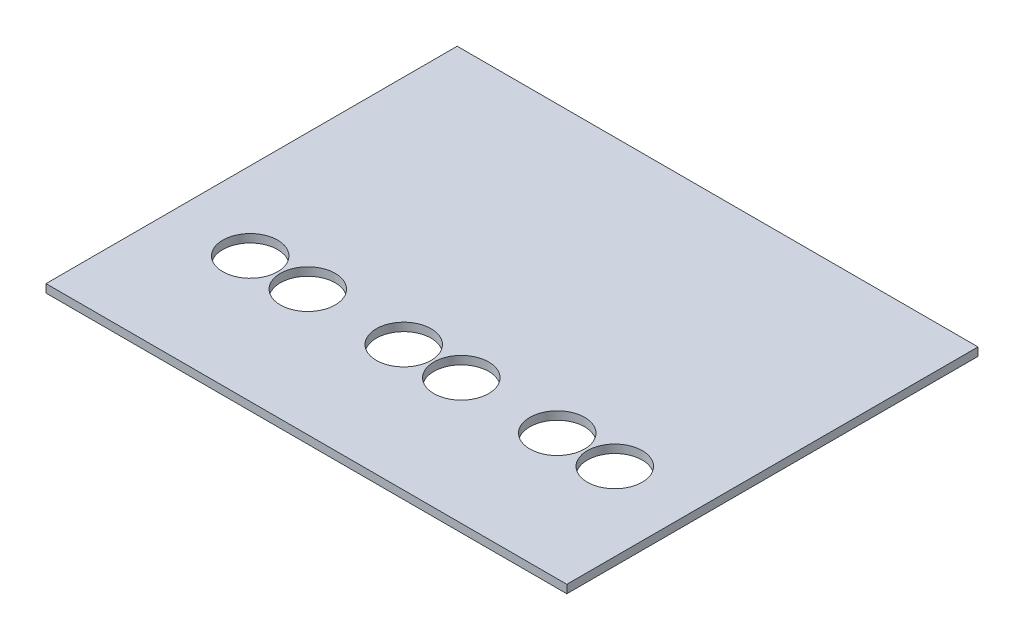
ISO-10303-21;
HEADER;
FILE_DESCRIPTION(('STEP AP214'),'2;1');
FILE_NAME('part.step','',(''),(''),'','','');
FILE_SCHEMA(('AUTOMOTIVE_DESIGN { 1 0 10303 214 1 1 1 1 }'));
ENDSEC;
DATA;
#1=APPLICATION_CONTEXT('core data for automotive mechanical design processes');
#2=APPLICATION_PROTOCOL_DEFINITION('international standard','automotive_design',2000,#1);
#3=PRODUCT_CONTEXT('',#1,'mechanical');
#4=PRODUCT('Part','Part','',(#3));
#5=PRODUCT_RELATED_PRODUCT_CATEGORY('part','',(#4));
#6=PRODUCT_DEFINITION_FORMATION('','',#4);
#7=PRODUCT_DEFINITION_CONTEXT('part definition',#1,'design');
#8=PRODUCT_DEFINITION('design','',#6,#7);
#9=PRODUCT_DEFINITION_SHAPE('','',#8);
#10=(LENGTH_UNIT() NAMED_UNIT(*) SI_UNIT(.MILLI.,.METRE.));
#11=(NAMED_UNIT(*) PLANE_ANGLE_UNIT() SI_UNIT($,.RADIAN.));
#12=(NAMED_UNIT(*) SI_UNIT($,.STERADIAN.) SOLID_ANGLE_UNIT());
#13=UNCERTAINTY_MEASURE_WITH_UNIT(LENGTH_MEASURE(1.E-05),#10,'distance_accuracy_value','');
#14=(GEOMETRIC_REPRESENTATION_CONTEXT(3) GLOBAL_UNCERTAINTY_ASSIGNED_CONTEXT((#13)) GLOBAL_UNIT_ASSIGNED_CONTEXT((#10,
#11,#12)) REPRESENTATION_CONTEXT('',''));
#15=CARTESIAN_POINT('',(0.,0.,0.));
#16=DIRECTION('',(0.,0.,1.));
#17=DIRECTION('',(1.,0.,0.));
#18=AXIS2_PLACEMENT_3D('',#15,#16,#17);
#19=CARTESIAN_POINT('',(0.,-3.,0.));
#20=DIRECTION('',(-1.,0.,0.));
#21=DIRECTION('',(0.,0.,1.));
#22=AXIS2_PLACEMENT_3D('',#19,#20,#21);
#23=PLANE('',#22);
#24=DIRECTION('',(0.,0.,1.));
#25=VECTOR('',#24,1.);
#26=CARTESIAN_POINT('',(0.,0.,0.));
#27=LINE('',#26,#25);
#28=CARTESIAN_POINT('',(0.,0.,-150.));
#29=VERTEX_POINT('',#28);
#30=CARTESIAN_POINT('',(0.,0.,0.));
#31=VERTEX_POINT('',#30);
#32=EDGE_CURVE('E100',#29,#31,#27,.T.);
#33=ORIENTED_EDGE('',*,*,#32,.F.);
#34=DIRECTION('',(0.,1.,0.));
#35=VECTOR('',#34,1.);
#36=CARTESIAN_POINT('',(0.,-3.,-150.));
#37=LINE('',#36,#35);
#38=CARTESIAN_POINT('',(0.,-3.,-150.));
#39=VERTEX_POINT('',#38);
#40=EDGE_CURVE('E11',#39,#29,#37,.T.);
#41=ORIENTED_EDGE('',*,*,#40,.F.);
#42=DIRECTION('',(0.,0.,1.));
#43=VECTOR('',#42,1.);
#44=CARTESIAN_POINT('',(0.,-3.,0.));
#45=LINE('',#44,#43);
#46=CARTESIAN_POINT('',(0.,-3.,0.));
#47=VERTEX_POINT('',#46);
#48=EDGE_CURVE('E93',#39,#47,#45,.T.);
#49=ORIENTED_EDGE('',*,*,#48,.T.);
#50=DIRECTION('',(0.,1.,0.));
#51=VECTOR('',#50,1.);
#52=CARTESIAN_POINT('',(0.,-3.,0.));
#53=LINE('',#52,#51);
#54=EDGE_CURVE('E38',#47,#31,#53,.T.);
#55=ORIENTED_EDGE('',*,*,#54,.T.);
#56=EDGE_LOOP('',(#33,#41,#49,#55));
#57=FACE_BOUND('',#56,.T.);
#58=ADVANCED_FACE('F35',(#57),#23,.T.);
#59=CARTESIAN_POINT('',(0.,-3.,-150.));
#60=DIRECTION('',(0.,0.,-1.));
#61=DIRECTION('',(-1.,0.,0.));
#62=AXIS2_PLACEMENT_3D('',#59,#60,#61);
#63=PLANE('',#62);
#64=DIRECTION('',(-1.,0.,0.));
#65=VECTOR('',#64,1.);
#66=CARTESIAN_POINT('',(0.,0.,-150.));
#67=LINE('',#66,#65);
#68=CARTESIAN_POINT('',(190.,0.,-150.));
#69=VERTEX_POINT('',#68);
#70=EDGE_CURVE('E95',#69,#29,#67,.T.);
#71=ORIENTED_EDGE('',*,*,#70,.F.);
#72=DIRECTION('',(0.,1.,0.));
#73=VECTOR('',#72,1.);
#74=CARTESIAN_POINT('',(190.,-3.,-150.));
#75=LINE('',#74,#73);
#76=CARTESIAN_POINT('',(190.,-3.,-150.));
#77=VERTEX_POINT('',#76);
#78=EDGE_CURVE('E44',#77,#69,#75,.T.);
#79=ORIENTED_EDGE('',*,*,#78,.F.);
#80=DIRECTION('',(-1.,0.,0.));
#81=VECTOR('',#80,1.);
#82=CARTESIAN_POINT('',(0.,-3.,-150.));
#83=LINE('',#82,#81);
#84=EDGE_CURVE('E90',#77,#39,#83,.T.);
#85=ORIENTED_EDGE('',*,*,#84,.T.);
#86=ORIENTED_EDGE('',*,*,#40,.T.);
#87=EDGE_LOOP('',(#71,#79,#85,#86));
#88=FACE_BOUND('',#87,.T.);
#89=ADVANCED_FACE('F111',(#88),#63,.T.);
#90=CARTESIAN_POINT('',(190.,-3.,0.));
#91=DIRECTION('',(1.,0.,0.));
#92=DIRECTION('',(0.,0.,-1.));
#93=AXIS2_PLACEMENT_3D('',#90,#91,#92);
#94=PLANE('',#93);
#95=DIRECTION('',(0.,0.,-1.));
#96=VECTOR('',#95,1.);
#97=CARTESIAN_POINT('',(190.,0.,0.));
#98=LINE('',#97,#96);
#99=CARTESIAN_POINT('',(190.,0.,0.));
#100=VERTEX_POINT('',#99);
#101=EDGE_CURVE('E85',#100,#69,#98,.T.);
#102=ORIENTED_EDGE('',*,*,#101,.F.);
#103=DIRECTION('',(0.,1.,0.));
#104=VECTOR('',#103,1.);
#105=CARTESIAN_POINT('',(190.,-3.,0.));
#106=LINE('',#105,#104);
#107=CARTESIAN_POINT('',(190.,-3.,0.));
#108=VERTEX_POINT('',#107);
#109=EDGE_CURVE('E80',#108,#100,#106,.T.);
#110=ORIENTED_EDGE('',*,*,#109,.F.);
#111=DIRECTION('',(0.,0.,-1.));
#112=VECTOR('',#111,1.);
#113=CARTESIAN_POINT('',(190.,-3.,0.));
#114=LINE('',#113,#112);
#115=EDGE_CURVE('E83',#108,#77,#114,.T.);
#116=ORIENTED_EDGE('',*,*,#115,.T.);
#117=ORIENTED_EDGE('',*,*,#78,.T.);
#118=EDGE_LOOP('',(#102,#110,#116,#117));
#119=FACE_BOUND('',#118,.T.);
#120=ADVANCED_FACE('F82',(#119),#94,.T.);
#121=CARTESIAN_POINT('',(0.,-3.,0.));
#122=DIRECTION('',(0.,0.,1.));
#123=DIRECTION('',(1.,0.,0.));
#124=AXIS2_PLACEMENT_3D('',#121,#122,#123);
#125=PLANE('',#124);
#126=DIRECTION('',(1.,0.,0.));
#127=VECTOR('',#126,1.);
#128=CARTESIAN_POINT('',(0.,0.,0.));
#129=LINE('',#128,#127);
#130=EDGE_CURVE('E103',#31,#100,#129,.T.);
#131=ORIENTED_EDGE('',*,*,#130,.F.);
#132=ORIENTED_EDGE('',*,*,#54,.F.);
#133=DIRECTION('',(1.,0.,0.));
#134=VECTOR('',#133,1.);
#135=CARTESIAN_POINT('',(0.,-3.,0.));
#136=LINE('',#135,#134);
#137=EDGE_CURVE('E89',#47,#108,#136,.T.);
#138=ORIENTED_EDGE('',*,*,#137,.T.);
#139=ORIENTED_EDGE('',*,*,#109,.T.);
#140=EDGE_LOOP('',(#131,#132,#138,#139));
#141=FACE_BOUND('',#140,.T.);
#142=ADVANCED_FACE('F92',(#141),#125,.T.);
#143=CARTESIAN_POINT('',(0.,-3.,0.));
#144=DIRECTION('',(0.,-1.,0.));
#145=DIRECTION('',(0.,0.,-1.));
#146=AXIS2_PLACEMENT_3D('',#143,#144,#145);
#147=PLANE('',#146);
#148=CARTESIAN_POINT('',(161.5,-3.,-46.));
#149=DIRECTION('',(0.,1.,0.));
#150=DIRECTION('',(0.,0.,1.));
#151=AXIS2_PLACEMENT_3D('',#148,#149,#150);
#152=CIRCLE('',#151,10.);
#153=CARTESIAN_POINT('',(161.5,-3.,-36.));
#154=VERTEX_POINT('',#153);
#155=EDGE_CURVE('E160',#154,#154,#152,.T.);
#156=ORIENTED_EDGE('',*,*,#155,.T.);
#157=EDGE_LOOP('',(#156));
#158=FACE_BOUND('',#157,.T.);
#159=CARTESIAN_POINT('',(140.5,-3.,-46.));
#160=DIRECTION('',(0.,1.,0.));
#161=DIRECTION('',(0.,0.,1.));
#162=AXIS2_PLACEMENT_3D('',#159,#160,#161);
#163=CIRCLE('',#162,10.);
#164=CARTESIAN_POINT('',(140.5,-3.,-36.));
#165=VERTEX_POINT('',#164);
#166=EDGE_CURVE('E168',#165,#165,#163,.T.);
#167=ORIENTED_EDGE('',*,*,#166,.T.);
#168=EDGE_LOOP('',(#167));
#169=FACE_BOUND('',#168,.T.);
#170=CARTESIAN_POINT('',(105.5,-3.,-46.));
#171=DIRECTION('',(0.,1.,0.));
#172=DIRECTION('',(0.,0.,1.));
#173=AXIS2_PLACEMENT_3D('',#170,#171,#172);
#174=CIRCLE('',#173,9.99999999999999);
#175=CARTESIAN_POINT('',(105.5,-3.,-36.));
#176=VERTEX_POINT('',#175);
#177=EDGE_CURVE('E174',#176,#176,#174,.T.);
#178=ORIENTED_EDGE('',*,*,#177,.T.);
#179=EDGE_LOOP('',(#178));
#180=FACE_BOUND('',#179,.T.);
#181=CARTESIAN_POINT('',(84.5,-3.,-46.));
#182=DIRECTION('',(0.,1.,0.));
#183=DIRECTION('',(0.,0.,1.));
#184=AXIS2_PLACEMENT_3D('',#181,#182,#183);
#185=CIRCLE('',#184,9.99999999999999);
#186=CARTESIAN_POINT('',(84.5,-3.,-36.));
#187=VERTEX_POINT('',#186);
#188=EDGE_CURVE('E180',#187,#187,#185,.T.);
#189=ORIENTED_EDGE('',*,*,#188,.T.);
#190=EDGE_LOOP('',(#189));
#191=FACE_BOUND('',#190,.T.);
#192=CARTESIAN_POINT('',(49.5,-3.,-46.));
#193=DIRECTION('',(0.,1.,0.));
#194=DIRECTION('',(0.,0.,1.));
#195=AXIS2_PLACEMENT_3D('',#192,#193,#194);
#196=CIRCLE('',#195,10.);
#197=CARTESIAN_POINT('',(49.5,-3.,-36.));
#198=VERTEX_POINT('',#197);
#199=EDGE_CURVE('E186',#198,#198,#196,.T.);
#200=ORIENTED_EDGE('',*,*,#199,.T.);
#201=EDGE_LOOP('',(#200));
#202=FACE_BOUND('',#201,.T.);
#203=CARTESIAN_POINT('',(28.5,-3.,-46.));
#204=DIRECTION('',(0.,1.,0.));
#205=DIRECTION('',(0.,0.,1.));
#206=AXIS2_PLACEMENT_3D('',#203,#204,#205);
#207=CIRCLE('',#206,10.);
#208=CARTESIAN_POINT('',(28.5,-3.,-36.));
#209=VERTEX_POINT('',#208);
#210=EDGE_CURVE('E104',#209,#209,#207,.T.);
#211=ORIENTED_EDGE('',*,*,#210,.T.);
#212=EDGE_LOOP('',(#211));
#213=FACE_BOUND('',#212,.T.);
#214=ORIENTED_EDGE('',*,*,#48,.F.);
#215=ORIENTED_EDGE('',*,*,#84,.F.);
#216=ORIENTED_EDGE('',*,*,#115,.F.);
#217=ORIENTED_EDGE('',*,*,#137,.F.);
#218=EDGE_LOOP('',(#214,#215,#216,#217));
#219=FACE_BOUND('',#218,.T.);
#220=ADVANCED_FACE('F88',(#158,#169,#180,#191,#202,#213,#219),#147,.T.);
#221=CARTESIAN_POINT('',(0.,0.,0.));
#222=DIRECTION('',(0.,-1.,0.));
#223=DIRECTION('',(0.,0.,-1.));
#224=AXIS2_PLACEMENT_3D('',#221,#222,#223);
#225=PLANE('',#224);
#226=CARTESIAN_POINT('',(161.5,0.,-46.));
#227=DIRECTION('',(0.,1.,0.));
#228=DIRECTION('',(0.,0.,1.));
#229=AXIS2_PLACEMENT_3D('',#226,#227,#228);
#230=CIRCLE('',#229,10.);
#231=CARTESIAN_POINT('',(161.5,0.,-36.));
#232=VERTEX_POINT('',#231);
#233=EDGE_CURVE('E163',#232,#232,#230,.T.);
#234=ORIENTED_EDGE('',*,*,#233,.F.);
#235=EDGE_LOOP('',(#234));
#236=FACE_BOUND('',#235,.T.);
#237=CARTESIAN_POINT('',(140.5,0.,-46.));
#238=DIRECTION('',(0.,1.,0.));
#239=DIRECTION('',(0.,0.,1.));
#240=AXIS2_PLACEMENT_3D('',#237,#238,#239);
#241=CIRCLE('',#240,10.);
#242=CARTESIAN_POINT('',(140.5,0.,-36.));
#243=VERTEX_POINT('',#242);
#244=EDGE_CURVE('E165',#243,#243,#241,.T.);
#245=ORIENTED_EDGE('',*,*,#244,.F.);
#246=EDGE_LOOP('',(#245));
#247=FACE_BOUND('',#246,.T.);
#248=CARTESIAN_POINT('',(105.5,0.,-46.));
#249=DIRECTION('',(0.,1.,0.));
#250=DIRECTION('',(0.,0.,1.));
#251=AXIS2_PLACEMENT_3D('',#248,#249,#250);
#252=CIRCLE('',#251,9.99999999999999);
#253=CARTESIAN_POINT('',(105.5,0.,-36.));
#254=VERTEX_POINT('',#253);
#255=EDGE_CURVE('E171',#254,#254,#252,.T.);
#256=ORIENTED_EDGE('',*,*,#255,.F.);
#257=EDGE_LOOP('',(#256));
#258=FACE_BOUND('',#257,.T.);
#259=CARTESIAN_POINT('',(84.5,0.,-46.));
#260=DIRECTION('',(0.,1.,0.));
#261=DIRECTION('',(0.,0.,1.));
#262=AXIS2_PLACEMENT_3D('',#259,#260,#261);
#263=CIRCLE('',#262,9.99999999999999);
#264=CARTESIAN_POINT('',(84.5,0.,-36.));
#265=VERTEX_POINT('',#264);
#266=EDGE_CURVE('E177',#265,#265,#263,.T.);
#267=ORIENTED_EDGE('',*,*,#266,.F.);
#268=EDGE_LOOP('',(#267));
#269=FACE_BOUND('',#268,.T.);
#270=CARTESIAN_POINT('',(49.5,0.,-46.));
#271=DIRECTION('',(0.,1.,0.));
#272=DIRECTION('',(0.,0.,1.));
#273=AXIS2_PLACEMENT_3D('',#270,#271,#272);
#274=CIRCLE('',#273,10.);
#275=CARTESIAN_POINT('',(49.5,0.,-36.));
#276=VERTEX_POINT('',#275);
#277=EDGE_CURVE('E183',#276,#276,#274,.T.);
#278=ORIENTED_EDGE('',*,*,#277,.F.);
#279=EDGE_LOOP('',(#278));
#280=FACE_BOUND('',#279,.T.);
#281=CARTESIAN_POINT('',(28.5,0.,-46.));
#282=DIRECTION('',(0.,1.,0.));
#283=DIRECTION('',(0.,0.,1.));
#284=AXIS2_PLACEMENT_3D('',#281,#282,#283);
#285=CIRCLE('',#284,10.);
#286=CARTESIAN_POINT('',(28.5,0.,-36.));
#287=VERTEX_POINT('',#286);
#288=EDGE_CURVE('E189',#287,#287,#285,.T.);
#289=ORIENTED_EDGE('',*,*,#288,.F.);
#290=EDGE_LOOP('',(#289));
#291=FACE_BOUND('',#290,.T.);
#292=ORIENTED_EDGE('',*,*,#32,.T.);
#293=ORIENTED_EDGE('',*,*,#130,.T.);
#294=ORIENTED_EDGE('',*,*,#101,.T.);
#295=ORIENTED_EDGE('',*,*,#70,.T.);
#296=EDGE_LOOP('',(#292,#293,#294,#295));
#297=FACE_BOUND('',#296,.T.);
#298=ADVANCED_FACE('F110',(#236,#247,#258,#269,#280,#291,#297),#225,.F.);
#299=CARTESIAN_POINT('',(28.5,-3.,-46.));
#300=DIRECTION('',(0.,1.,0.));
#301=DIRECTION('',(0.,0.,1.));
#302=AXIS2_PLACEMENT_3D('',#299,#300,#301);
#303=CYLINDRICAL_SURFACE('',#302,10.);
#304=ORIENTED_EDGE('',*,*,#210,.F.);
#305=EDGE_LOOP('',(#304));
#306=FACE_BOUND('',#305,.T.);
#307=ORIENTED_EDGE('',*,*,#288,.T.);
#308=EDGE_LOOP('',(#307));
#309=FACE_BOUND('',#308,.T.);
#310=ADVANCED_FACE('F129',(#306,#309),#303,.F.);
#311=CARTESIAN_POINT('',(49.5,-3.,-46.));
#312=DIRECTION('',(0.,1.,0.));
#313=DIRECTION('',(0.,0.,1.));
#314=AXIS2_PLACEMENT_3D('',#311,#312,#313);
#315=CYLINDRICAL_SURFACE('',#314,10.);
#316=ORIENTED_EDGE('',*,*,#199,.F.);
#317=EDGE_LOOP('',(#316));
#318=FACE_BOUND('',#317,.T.);
#319=ORIENTED_EDGE('',*,*,#277,.T.);
#320=EDGE_LOOP('',(#319));
#321=FACE_BOUND('',#320,.T.);
#322=ADVANCED_FACE('F136',(#318,#321),#315,.F.);
#323=CARTESIAN_POINT('',(84.5,-3.,-46.));
#324=DIRECTION('',(0.,1.,0.));
#325=DIRECTION('',(0.,0.,1.));
#326=AXIS2_PLACEMENT_3D('',#323,#324,#325);
#327=CYLINDRICAL_SURFACE('',#326,9.99999999999999);
#328=ORIENTED_EDGE('',*,*,#188,.F.);
#329=EDGE_LOOP('',(#328));
#330=FACE_BOUND('',#329,.T.);
#331=ORIENTED_EDGE('',*,*,#266,.T.);
#332=EDGE_LOOP('',(#331));
#333=FACE_BOUND('',#332,.T.);
#334=ADVANCED_FACE('F140',(#330,#333),#327,.F.);
#335=CARTESIAN_POINT('',(105.5,-3.,-46.));
#336=DIRECTION('',(0.,1.,0.));
#337=DIRECTION('',(0.,0.,1.));
#338=AXIS2_PLACEMENT_3D('',#335,#336,#337);
#339=CYLINDRICAL_SURFACE('',#338,9.99999999999999);
#340=ORIENTED_EDGE('',*,*,#177,.F.);
#341=EDGE_LOOP('',(#340));
#342=FACE_BOUND('',#341,.T.);
#343=ORIENTED_EDGE('',*,*,#255,.T.);
#344=EDGE_LOOP('',(#343));
#345=FACE_BOUND('',#344,.T.);
#346=ADVANCED_FACE('F144',(#342,#345),#339,.F.);
#347=CARTESIAN_POINT('',(140.5,-3.,-46.));
#348=DIRECTION('',(0.,1.,0.));
#349=DIRECTION('',(0.,0.,1.));
#350=AXIS2_PLACEMENT_3D('',#347,#348,#349);
#351=CYLINDRICAL_SURFACE('',#350,10.);
#352=ORIENTED_EDGE('',*,*,#166,.F.);
#353=EDGE_LOOP('',(#352));
#354=FACE_BOUND('',#353,.T.);
#355=ORIENTED_EDGE('',*,*,#244,.T.);
#356=EDGE_LOOP('',(#355));
#357=FACE_BOUND('',#356,.T.);
#358=ADVANCED_FACE('F148',(#354,#357),#351,.F.);
#359=CARTESIAN_POINT('',(161.5,-3.,-46.));
#360=DIRECTION('',(0.,1.,0.));
#361=DIRECTION('',(0.,0.,1.));
#362=AXIS2_PLACEMENT_3D('',#359,#360,#361);
#363=CYLINDRICAL_SURFACE('',#362,10.);
#364=ORIENTED_EDGE('',*,*,#155,.F.);
#365=EDGE_LOOP('',(#364));
#366=FACE_BOUND('',#365,.T.);
#367=ORIENTED_EDGE('',*,*,#233,.T.);
#368=EDGE_LOOP('',(#367));
#369=FACE_BOUND('',#368,.T.);
#370=ADVANCED_FACE('F152',(#366,#369),#363,.F.);
#371=CLOSED_SHELL('',(#58,#89,#120,#142,#220,#298,#310,#322,#334,#346,#358,#370));
#372=MANIFOLD_SOLID_BREP('B2',#371);
#373=ADVANCED_BREP_SHAPE_REPRESENTATION('',(#18,#372),#14);
#374=SHAPE_DEFINITION_REPRESENTATION(#9,#373);
ENDSEC;
END-ISO-10303-21;
